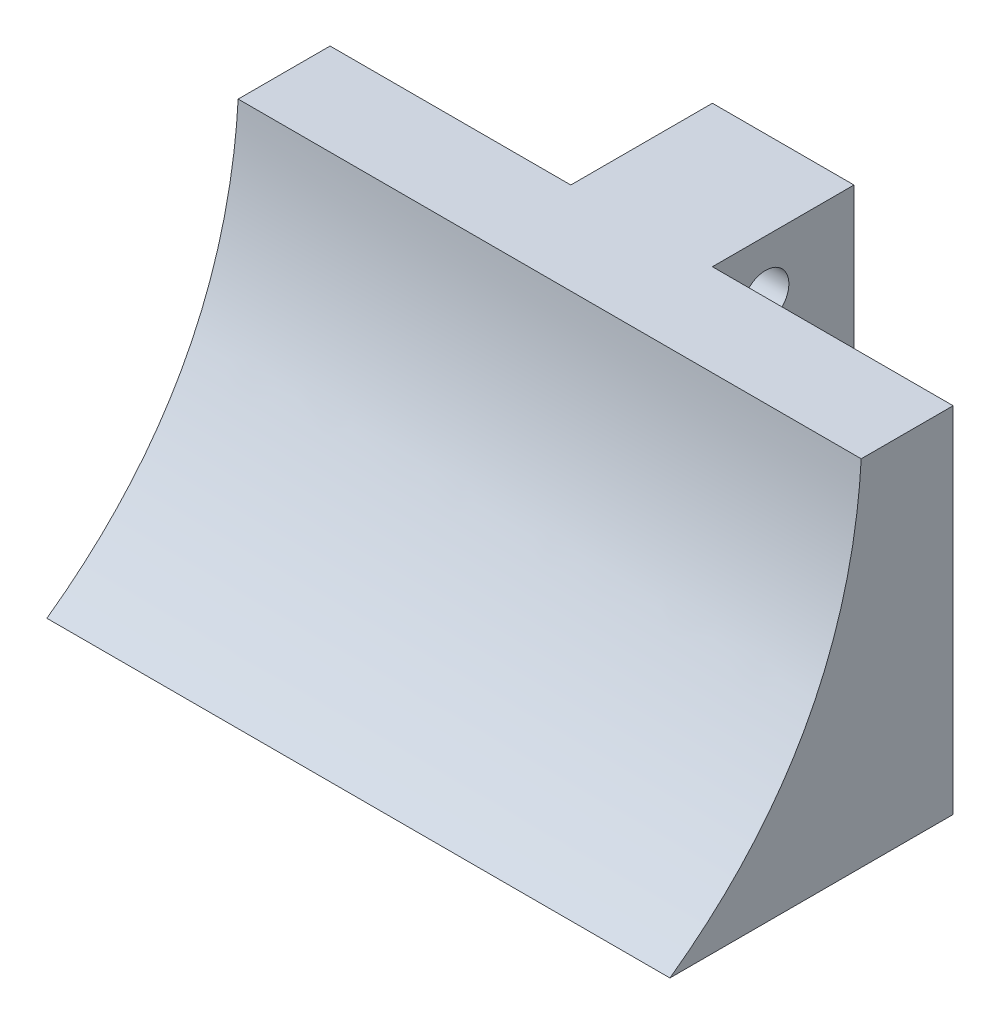
ISO-10303-21;
HEADER;
FILE_DESCRIPTION(('STEP AP214'),'2;1');
FILE_NAME('part.step','',(''),(''),'','','');
FILE_SCHEMA(('AUTOMOTIVE_DESIGN { 1 0 10303 214 1 1 1 1 }'));
ENDSEC;
DATA;
#1=APPLICATION_CONTEXT('core data for automotive mechanical design processes');
#2=APPLICATION_PROTOCOL_DEFINITION('international standard','automotive_design',2000,#1);
#3=PRODUCT_CONTEXT('',#1,'mechanical');
#4=PRODUCT('Part','Part','',(#3));
#5=PRODUCT_RELATED_PRODUCT_CATEGORY('part','',(#4));
#6=PRODUCT_DEFINITION_FORMATION('','',#4);
#7=PRODUCT_DEFINITION_CONTEXT('part definition',#1,'design');
#8=PRODUCT_DEFINITION('design','',#6,#7);
#9=PRODUCT_DEFINITION_SHAPE('','',#8);
#10=(LENGTH_UNIT() NAMED_UNIT(*) SI_UNIT(.MILLI.,.METRE.));
#11=(NAMED_UNIT(*) PLANE_ANGLE_UNIT() SI_UNIT($,.RADIAN.));
#12=(NAMED_UNIT(*) SI_UNIT($,.STERADIAN.) SOLID_ANGLE_UNIT());
#13=UNCERTAINTY_MEASURE_WITH_UNIT(LENGTH_MEASURE(1.E-05),#10,'distance_accuracy_value','');
#14=(GEOMETRIC_REPRESENTATION_CONTEXT(3) GLOBAL_UNCERTAINTY_ASSIGNED_CONTEXT((#13)) GLOBAL_UNIT_ASSIGNED_CONTEXT((#10,
#11,#12)) REPRESENTATION_CONTEXT('',''));
#15=CARTESIAN_POINT('',(0.,0.,0.));
#16=DIRECTION('',(0.,0.,1.));
#17=DIRECTION('',(1.,0.,0.));
#18=AXIS2_PLACEMENT_3D('',#15,#16,#17);
#19=CARTESIAN_POINT('',(0.,50.,0.));
#20=DIRECTION('',(1.,0.,0.));
#21=DIRECTION('',(0.,0.,-1.));
#22=AXIS2_PLACEMENT_3D('',#19,#20,#21);
#23=PLANE('',#22);
#24=DIRECTION('',(0.,0.,1.));
#25=VECTOR('',#24,1.);
#26=CARTESIAN_POINT('',(0.,0.,0.));
#27=LINE('',#26,#25);
#28=CARTESIAN_POINT('',(0.,0.,0.));
#29=VERTEX_POINT('',#28);
#30=CARTESIAN_POINT('',(0.,0.,40.));
#31=VERTEX_POINT('',#30);
#32=EDGE_CURVE('E129',#29,#31,#27,.T.);
#33=ORIENTED_EDGE('',*,*,#32,.T.);
#34=CARTESIAN_POINT('',(0.,0.,40.));
#35=CARTESIAN_POINT('',(0.,17.9786516430762,14.8301409935313));
#36=CARTESIAN_POINT('',(0.,50.,12.9804536392054));
#37=B_SPLINE_CURVE_WITH_KNOTS('',2,(#34,#35,#36),.UNSPECIFIED.,.F.,.F.,(3,3),(0.,1.),.UNSPECIFIED.);
#38=CARTESIAN_POINT('',(0.,50.,12.9804536392054));
#39=VERTEX_POINT('',#38);
#40=EDGE_CURVE('E268',#31,#39,#37,.T.);
#41=ORIENTED_EDGE('',*,*,#40,.T.);
#42=DIRECTION('',(0.,0.,1.));
#43=VECTOR('',#42,1.);
#44=CARTESIAN_POINT('',(0.,50.,0.));
#45=LINE('',#44,#43);
#46=CARTESIAN_POINT('',(0.,50.,0.));
#47=VERTEX_POINT('',#46);
#48=EDGE_CURVE('E121',#47,#39,#45,.T.);
#49=ORIENTED_EDGE('',*,*,#48,.F.);
#50=DIRECTION('',(0.,-1.,0.));
#51=VECTOR('',#50,1.);
#52=CARTESIAN_POINT('',(0.,50.,0.));
#53=LINE('',#52,#51);
#54=EDGE_CURVE('E113',#47,#29,#53,.T.);
#55=ORIENTED_EDGE('',*,*,#54,.T.);
#56=EDGE_LOOP('',(#33,#41,#49,#55));
#57=FACE_BOUND('',#56,.T.);
#58=ADVANCED_FACE('F33',(#57),#23,.F.);
#59=CARTESIAN_POINT('',(88.,50.,0.));
#60=DIRECTION('',(-1.,0.,0.));
#61=DIRECTION('',(0.,0.,1.));
#62=AXIS2_PLACEMENT_3D('',#59,#60,#61);
#63=PLANE('',#62);
#64=DIRECTION('',(0.,0.,-1.));
#65=VECTOR('',#64,1.);
#66=CARTESIAN_POINT('',(88.,50.,0.));
#67=LINE('',#66,#65);
#68=CARTESIAN_POINT('',(88.,50.,12.9804536392054));
#69=VERTEX_POINT('',#68);
#70=CARTESIAN_POINT('',(88.,50.,0.));
#71=VERTEX_POINT('',#70);
#72=EDGE_CURVE('E77',#69,#71,#67,.T.);
#73=ORIENTED_EDGE('',*,*,#72,.F.);
#74=CARTESIAN_POINT('',(88.,0.,40.));
#75=CARTESIAN_POINT('',(88.,17.9786516430762,14.8301409935313));
#76=CARTESIAN_POINT('',(88.,50.,12.9804536392054));
#77=B_SPLINE_CURVE_WITH_KNOTS('',2,(#74,#75,#76),.UNSPECIFIED.,.F.,.F.,(3,3),(0.,1.),.UNSPECIFIED.);
#78=CARTESIAN_POINT('',(88.,0.,40.));
#79=VERTEX_POINT('',#78);
#80=EDGE_CURVE('E255',#79,#69,#77,.T.);
#81=ORIENTED_EDGE('',*,*,#80,.F.);
#82=DIRECTION('',(0.,0.,-1.));
#83=VECTOR('',#82,1.);
#84=CARTESIAN_POINT('',(88.,0.,0.));
#85=LINE('',#84,#83);
#86=CARTESIAN_POINT('',(88.,0.,0.));
#87=VERTEX_POINT('',#86);
#88=EDGE_CURVE('E117',#79,#87,#85,.T.);
#89=ORIENTED_EDGE('',*,*,#88,.T.);
#90=DIRECTION('',(0.,-1.,0.));
#91=VECTOR('',#90,1.);
#92=CARTESIAN_POINT('',(88.,50.,0.));
#93=LINE('',#92,#91);
#94=EDGE_CURVE('E11',#71,#87,#93,.T.);
#95=ORIENTED_EDGE('',*,*,#94,.F.);
#96=EDGE_LOOP('',(#73,#81,#89,#95));
#97=FACE_BOUND('',#96,.T.);
#98=ADVANCED_FACE('F180',(#97),#63,.F.);
#99=CARTESIAN_POINT('',(54.,50.,-20.));
#100=DIRECTION('',(-1.,0.,0.));
#101=DIRECTION('',(0.,0.,1.));
#102=AXIS2_PLACEMENT_3D('',#99,#100,#101);
#103=PLANE('',#102);
#104=CARTESIAN_POINT('',(54.,27.5,-7.50000000000001));
#105=DIRECTION('',(1.,0.,0.));
#106=DIRECTION('',(0.,0.,-1.));
#107=AXIS2_PLACEMENT_3D('',#104,#105,#106);
#108=CIRCLE('',#107,3.3);
#109=CARTESIAN_POINT('',(54.,27.5,-10.8));
#110=VERTEX_POINT('',#109);
#111=EDGE_CURVE('E290',#110,#110,#108,.T.);
#112=ORIENTED_EDGE('',*,*,#111,.F.);
#113=EDGE_LOOP('',(#112));
#114=FACE_BOUND('',#113,.T.);
#115=CARTESIAN_POINT('',(54.,42.5,-7.5));
#116=DIRECTION('',(1.,0.,0.));
#117=DIRECTION('',(0.,0.,-1.));
#118=AXIS2_PLACEMENT_3D('',#115,#116,#117);
#119=CIRCLE('',#118,3.3);
#120=CARTESIAN_POINT('',(54.,42.5,-10.8));
#121=VERTEX_POINT('',#120);
#122=EDGE_CURVE('E283',#121,#121,#119,.T.);
#123=ORIENTED_EDGE('',*,*,#122,.F.);
#124=EDGE_LOOP('',(#123));
#125=FACE_BOUND('',#124,.T.);
#126=DIRECTION('',(0.,-1.,0.));
#127=VECTOR('',#126,1.);
#128=CARTESIAN_POINT('',(54.,50.,0.));
#129=LINE('',#128,#127);
#130=CARTESIAN_POINT('',(54.,50.,0.));
#131=VERTEX_POINT('',#130);
#132=CARTESIAN_POINT('',(54.,15.,0.));
#133=VERTEX_POINT('',#132);
#134=EDGE_CURVE('E42',#131,#133,#129,.T.);
#135=ORIENTED_EDGE('',*,*,#134,.T.);
#136=DIRECTION('',(0.,0.,1.));
#137=VECTOR('',#136,1.);
#138=CARTESIAN_POINT('',(54.,15.,-20.));
#139=LINE('',#138,#137);
#140=CARTESIAN_POINT('',(54.,15.,-20.));
#141=VERTEX_POINT('',#140);
#142=EDGE_CURVE('E156',#141,#133,#139,.T.);
#143=ORIENTED_EDGE('',*,*,#142,.F.);
#144=DIRECTION('',(0.,-1.,0.));
#145=VECTOR('',#144,1.);
#146=CARTESIAN_POINT('',(54.,50.,-20.));
#147=LINE('',#146,#145);
#148=CARTESIAN_POINT('',(54.,50.,-20.));
#149=VERTEX_POINT('',#148);
#150=EDGE_CURVE('E107',#149,#141,#147,.T.);
#151=ORIENTED_EDGE('',*,*,#150,.F.);
#152=DIRECTION('',(0.,0.,-1.));
#153=VECTOR('',#152,1.);
#154=CARTESIAN_POINT('',(54.,50.,-20.));
#155=LINE('',#154,#153);
#156=EDGE_CURVE('E94',#131,#149,#155,.T.);
#157=ORIENTED_EDGE('',*,*,#156,.F.);
#158=EDGE_LOOP('',(#135,#143,#151,#157));
#159=FACE_BOUND('',#158,.T.);
#160=ADVANCED_FACE('F154',(#114,#125,#159),#103,.F.);
#161=CARTESIAN_POINT('',(34.,50.,-20.));
#162=DIRECTION('',(0.,0.,1.));
#163=DIRECTION('',(1.,0.,0.));
#164=AXIS2_PLACEMENT_3D('',#161,#162,#163);
#165=PLANE('',#164);
#166=ORIENTED_EDGE('',*,*,#150,.T.);
#167=DIRECTION('',(1.,0.,0.));
#168=VECTOR('',#167,1.);
#169=CARTESIAN_POINT('',(14.,15.,-20.));
#170=LINE('',#169,#168);
#171=CARTESIAN_POINT('',(34.,15.,-20.));
#172=VERTEX_POINT('',#171);
#173=EDGE_CURVE('E104',#172,#141,#170,.T.);
#174=ORIENTED_EDGE('',*,*,#173,.F.);
#175=DIRECTION('',(0.,-1.,0.));
#176=VECTOR('',#175,1.);
#177=CARTESIAN_POINT('',(34.,50.,-20.));
#178=LINE('',#177,#176);
#179=CARTESIAN_POINT('',(34.,50.,-20.));
#180=VERTEX_POINT('',#179);
#181=EDGE_CURVE('E101',#180,#172,#178,.T.);
#182=ORIENTED_EDGE('',*,*,#181,.F.);
#183=DIRECTION('',(-1.,0.,0.));
#184=VECTOR('',#183,1.);
#185=CARTESIAN_POINT('',(34.,50.,-20.));
#186=LINE('',#185,#184);
#187=EDGE_CURVE('E87',#149,#180,#186,.T.);
#188=ORIENTED_EDGE('',*,*,#187,.F.);
#189=EDGE_LOOP('',(#166,#174,#182,#188));
#190=FACE_BOUND('',#189,.T.);
#191=ADVANCED_FACE('F102',(#190),#165,.F.);
#192=CARTESIAN_POINT('',(34.,50.,0.));
#193=DIRECTION('',(1.,0.,0.));
#194=DIRECTION('',(0.,0.,-1.));
#195=AXIS2_PLACEMENT_3D('',#192,#193,#194);
#196=PLANE('',#195);
#197=CARTESIAN_POINT('',(34.,27.5,-7.50000000000001));
#198=DIRECTION('',(1.,0.,0.));
#199=DIRECTION('',(0.,0.,-1.));
#200=AXIS2_PLACEMENT_3D('',#197,#198,#199);
#201=CIRCLE('',#200,3.3);
#202=CARTESIAN_POINT('',(34.,27.5,-10.8));
#203=VERTEX_POINT('',#202);
#204=EDGE_CURVE('E287',#203,#203,#201,.F.);
#205=ORIENTED_EDGE('',*,*,#204,.F.);
#206=EDGE_LOOP('',(#205));
#207=FACE_BOUND('',#206,.T.);
#208=CARTESIAN_POINT('',(34.,42.5,-7.5));
#209=DIRECTION('',(1.,0.,0.));
#210=DIRECTION('',(0.,0.,-1.));
#211=AXIS2_PLACEMENT_3D('',#208,#209,#210);
#212=CIRCLE('',#211,3.3);
#213=CARTESIAN_POINT('',(34.,42.5,-10.8));
#214=VERTEX_POINT('',#213);
#215=EDGE_CURVE('E253',#214,#214,#212,.F.);
#216=ORIENTED_EDGE('',*,*,#215,.F.);
#217=EDGE_LOOP('',(#216));
#218=FACE_BOUND('',#217,.T.);
#219=ORIENTED_EDGE('',*,*,#181,.T.);
#220=DIRECTION('',(0.,0.,1.));
#221=VECTOR('',#220,1.);
#222=CARTESIAN_POINT('',(34.,15.,0.));
#223=LINE('',#222,#221);
#224=CARTESIAN_POINT('',(34.,15.,0.));
#225=VERTEX_POINT('',#224);
#226=EDGE_CURVE('E132',#172,#225,#223,.T.);
#227=ORIENTED_EDGE('',*,*,#226,.T.);
#228=DIRECTION('',(0.,-1.,0.));
#229=VECTOR('',#228,1.);
#230=CARTESIAN_POINT('',(34.,50.,0.));
#231=LINE('',#230,#229);
#232=CARTESIAN_POINT('',(34.,50.,0.));
#233=VERTEX_POINT('',#232);
#234=EDGE_CURVE('E108',#233,#225,#231,.T.);
#235=ORIENTED_EDGE('',*,*,#234,.F.);
#236=DIRECTION('',(0.,0.,1.));
#237=VECTOR('',#236,1.);
#238=CARTESIAN_POINT('',(34.,50.,0.));
#239=LINE('',#238,#237);
#240=EDGE_CURVE('E91',#180,#233,#239,.T.);
#241=ORIENTED_EDGE('',*,*,#240,.F.);
#242=EDGE_LOOP('',(#219,#227,#235,#241));
#243=FACE_BOUND('',#242,.T.);
#244=ADVANCED_FACE('F110',(#207,#218,#243),#196,.F.);
#245=CARTESIAN_POINT('',(0.,50.,0.));
#246=DIRECTION('',(0.,0.,1.));
#247=DIRECTION('',(1.,0.,0.));
#248=AXIS2_PLACEMENT_3D('',#245,#246,#247);
#249=PLANE('',#248);
#250=ORIENTED_EDGE('',*,*,#234,.T.);
#251=DIRECTION('',(1.,0.,0.));
#252=VECTOR('',#251,1.);
#253=CARTESIAN_POINT('',(14.,15.,0.));
#254=LINE('',#253,#252);
#255=EDGE_CURVE('E135',#225,#133,#254,.T.);
#256=ORIENTED_EDGE('',*,*,#255,.T.);
#257=ORIENTED_EDGE('',*,*,#134,.F.);
#258=DIRECTION('',(-1.,0.,0.));
#259=VECTOR('',#258,1.);
#260=CARTESIAN_POINT('',(54.,50.,0.));
#261=LINE('',#260,#259);
#262=EDGE_CURVE('E145',#71,#131,#261,.T.);
#263=ORIENTED_EDGE('',*,*,#262,.F.);
#264=ORIENTED_EDGE('',*,*,#94,.T.);
#265=DIRECTION('',(-1.,0.,0.));
#266=VECTOR('',#265,1.);
#267=CARTESIAN_POINT('',(0.,0.,0.));
#268=LINE('',#267,#266);
#269=EDGE_CURVE('E66',#87,#29,#268,.T.);
#270=ORIENTED_EDGE('',*,*,#269,.T.);
#271=ORIENTED_EDGE('',*,*,#54,.F.);
#272=DIRECTION('',(-1.,0.,0.));
#273=VECTOR('',#272,1.);
#274=CARTESIAN_POINT('',(0.,50.,0.));
#275=LINE('',#274,#273);
#276=EDGE_CURVE('E51',#233,#47,#275,.T.);
#277=ORIENTED_EDGE('',*,*,#276,.F.);
#278=EDGE_LOOP('',(#250,#256,#257,#263,#264,#270,#271,#277));
#279=FACE_BOUND('',#278,.T.);
#280=ADVANCED_FACE('F148',(#279),#249,.F.);
#281=CARTESIAN_POINT('',(0.,50.,0.));
#282=DIRECTION('',(0.,1.,0.));
#283=DIRECTION('',(0.,0.,1.));
#284=AXIS2_PLACEMENT_3D('',#281,#282,#283);
#285=PLANE('',#284);
#286=DIRECTION('',(1.,0.,0.));
#287=VECTOR('',#286,1.);
#288=CARTESIAN_POINT('',(-46.,50.,12.9804536392054));
#289=LINE('',#288,#287);
#290=EDGE_CURVE('E263',#39,#69,#289,.T.);
#291=ORIENTED_EDGE('',*,*,#290,.T.);
#292=ORIENTED_EDGE('',*,*,#72,.T.);
#293=ORIENTED_EDGE('',*,*,#262,.T.);
#294=ORIENTED_EDGE('',*,*,#156,.T.);
#295=ORIENTED_EDGE('',*,*,#187,.T.);
#296=ORIENTED_EDGE('',*,*,#240,.T.);
#297=ORIENTED_EDGE('',*,*,#276,.T.);
#298=ORIENTED_EDGE('',*,*,#48,.T.);
#299=EDGE_LOOP('',(#291,#292,#293,#294,#295,#296,#297,#298));
#300=FACE_BOUND('',#299,.T.);
#301=ADVANCED_FACE('F89',(#300),#285,.T.);
#302=CARTESIAN_POINT('',(0.,0.,0.));
#303=DIRECTION('',(0.,1.,0.));
#304=DIRECTION('',(0.,0.,1.));
#305=AXIS2_PLACEMENT_3D('',#302,#303,#304);
#306=PLANE('',#305);
#307=ORIENTED_EDGE('',*,*,#269,.F.);
#308=ORIENTED_EDGE('',*,*,#88,.F.);
#309=DIRECTION('',(1.,0.,0.));
#310=VECTOR('',#309,1.);
#311=CARTESIAN_POINT('',(0.,0.,40.));
#312=LINE('',#311,#310);
#313=EDGE_CURVE('E119',#31,#79,#312,.T.);
#314=ORIENTED_EDGE('',*,*,#313,.F.);
#315=ORIENTED_EDGE('',*,*,#32,.F.);
#316=EDGE_LOOP('',(#307,#308,#314,#315));
#317=FACE_BOUND('',#316,.T.);
#318=ADVANCED_FACE('F168',(#317),#306,.F.);
#319=CARTESIAN_POINT('',(14.,15.,-20.));
#320=DIRECTION('',(0.,1.,0.));
#321=DIRECTION('',(0.,0.,1.));
#322=AXIS2_PLACEMENT_3D('',#319,#320,#321);
#323=PLANE('',#322);
#324=ORIENTED_EDGE('',*,*,#173,.T.);
#325=ORIENTED_EDGE('',*,*,#142,.T.);
#326=ORIENTED_EDGE('',*,*,#255,.F.);
#327=ORIENTED_EDGE('',*,*,#226,.F.);
#328=EDGE_LOOP('',(#324,#325,#326,#327));
#329=FACE_BOUND('',#328,.T.);
#330=ADVANCED_FACE('F165',(#329),#323,.F.);
#331=CARTESIAN_POINT('',(-46.,0.,40.));
#332=CARTESIAN_POINT('',(-46.,17.9786516430762,14.8301409935313));
#333=CARTESIAN_POINT('',(-46.,50.,12.9804536392054));
#334=B_SPLINE_CURVE_WITH_KNOTS('',2,(#331,#332,#333),.UNSPECIFIED.,.F.,.F.,(3,3),(0.,1.),.UNSPECIFIED.);
#335=DIRECTION('',(1.,0.,0.));
#336=VECTOR('',#335,1.);
#337=SURFACE_OF_LINEAR_EXTRUSION('',#334,#336);
#338=ORIENTED_EDGE('',*,*,#313,.T.);
#339=ORIENTED_EDGE('',*,*,#80,.T.);
#340=ORIENTED_EDGE('',*,*,#290,.F.);
#341=ORIENTED_EDGE('',*,*,#40,.F.);
#342=EDGE_LOOP('',(#338,#339,#340,#341));
#343=FACE_BOUND('',#342,.T.);
#344=ADVANCED_FACE('F167',(#343),#337,.F.);
#345=CARTESIAN_POINT('',(-0.00149999999999456,42.5,-7.50000000000002));
#346=DIRECTION('',(1.,0.,0.));
#347=DIRECTION('',(0.,0.,-1.));
#348=AXIS2_PLACEMENT_3D('',#345,#346,#347);
#349=CYLINDRICAL_SURFACE('',#348,3.3);
#350=ORIENTED_EDGE('',*,*,#122,.T.);
#351=EDGE_LOOP('',(#350));
#352=FACE_BOUND('',#351,.T.);
#353=ORIENTED_EDGE('',*,*,#215,.T.);
#354=EDGE_LOOP('',(#353));
#355=FACE_BOUND('',#354,.T.);
#356=ADVANCED_FACE('F174',(#352,#355),#349,.F.);
#357=CARTESIAN_POINT('',(-0.00149999999999456,27.5,-7.50000000000003));
#358=DIRECTION('',(1.,0.,0.));
#359=DIRECTION('',(0.,0.,-1.));
#360=AXIS2_PLACEMENT_3D('',#357,#358,#359);
#361=CYLINDRICAL_SURFACE('',#360,3.3);
#362=ORIENTED_EDGE('',*,*,#111,.T.);
#363=EDGE_LOOP('',(#362));
#364=FACE_BOUND('',#363,.T.);
#365=ORIENTED_EDGE('',*,*,#204,.T.);
#366=EDGE_LOOP('',(#365));
#367=FACE_BOUND('',#366,.T.);
#368=ADVANCED_FACE('F231',(#364,#367),#361,.F.);
#369=CLOSED_SHELL('',(#58,#98,#160,#191,#244,#280,#301,#318,#330,#344,#356,#368));
#370=MANIFOLD_SOLID_BREP('B2',#369);
#371=ADVANCED_BREP_SHAPE_REPRESENTATION('',(#18,#370),#14);
#372=SHAPE_DEFINITION_REPRESENTATION(#9,#371);
ENDSEC;
END-ISO-10303-21;
